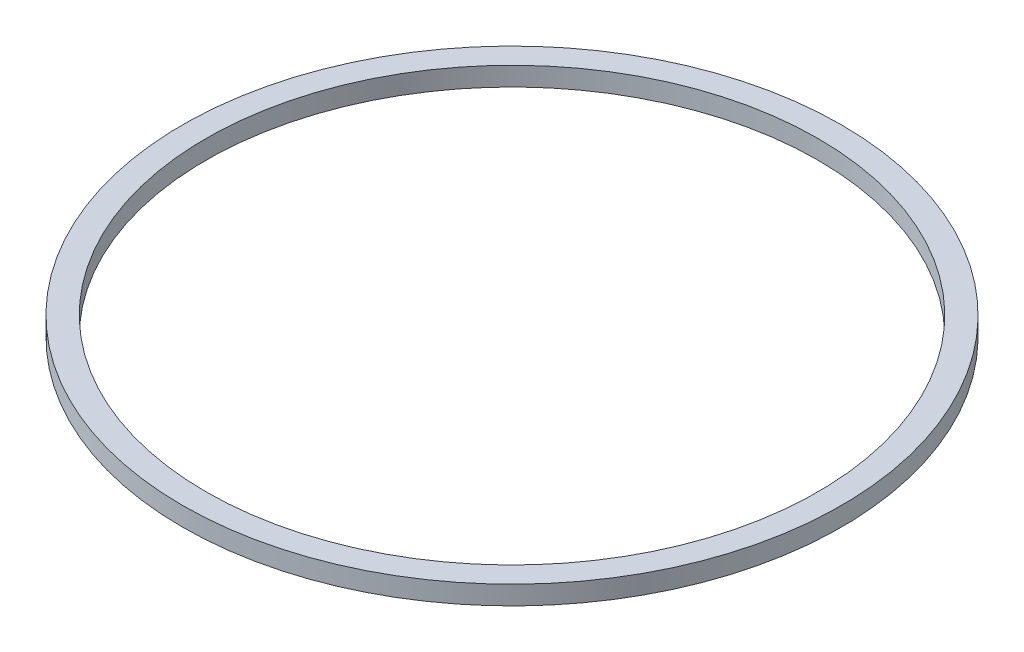
ISO-10303-21;
HEADER;
FILE_DESCRIPTION(('STEP AP214'),'2;1');
FILE_NAME('part.step','',(''),(''),'','','');
FILE_SCHEMA(('AUTOMOTIVE_DESIGN { 1 0 10303 214 1 1 1 1 }'));
ENDSEC;
DATA;
#1=APPLICATION_CONTEXT('core data for automotive mechanical design processes');
#2=APPLICATION_PROTOCOL_DEFINITION('international standard','automotive_design',2000,#1);
#3=PRODUCT_CONTEXT('',#1,'mechanical');
#4=PRODUCT('Part','Part','',(#3));
#5=PRODUCT_RELATED_PRODUCT_CATEGORY('part','',(#4));
#6=PRODUCT_DEFINITION_FORMATION('','',#4);
#7=PRODUCT_DEFINITION_CONTEXT('part definition',#1,'design');
#8=PRODUCT_DEFINITION('design','',#6,#7);
#9=PRODUCT_DEFINITION_SHAPE('','',#8);
#10=(LENGTH_UNIT() NAMED_UNIT(*) SI_UNIT(.MILLI.,.METRE.));
#11=(NAMED_UNIT(*) PLANE_ANGLE_UNIT() SI_UNIT($,.RADIAN.));
#12=(NAMED_UNIT(*) SI_UNIT($,.STERADIAN.) SOLID_ANGLE_UNIT());
#13=UNCERTAINTY_MEASURE_WITH_UNIT(LENGTH_MEASURE(1.E-05),#10,'distance_accuracy_value','');
#14=(GEOMETRIC_REPRESENTATION_CONTEXT(3) GLOBAL_UNCERTAINTY_ASSIGNED_CONTEXT((#13)) GLOBAL_UNIT_ASSIGNED_CONTEXT((#10,
#11,#12)) REPRESENTATION_CONTEXT('',''));
#15=CARTESIAN_POINT('',(0.,0.,0.));
#16=DIRECTION('',(0.,0.,1.));
#17=DIRECTION('',(1.,0.,0.));
#18=AXIS2_PLACEMENT_3D('',#15,#16,#17);
#19=CARTESIAN_POINT('',(0.,10.,0.));
#20=DIRECTION('',(0.,1.,0.));
#21=DIRECTION('',(0.,0.,1.));
#22=AXIS2_PLACEMENT_3D('',#19,#20,#21);
#23=PLANE('',#22);
#24=CARTESIAN_POINT('',(0.,10.,0.));
#25=DIRECTION('',(0.,1.,0.));
#26=DIRECTION('',(0.,0.,1.));
#27=AXIS2_PLACEMENT_3D('',#24,#25,#26);
#28=CIRCLE('',#27,350.);
#29=CARTESIAN_POINT('',(0.,10.,350.));
#30=VERTEX_POINT('',#29);
#31=EDGE_CURVE('E10',#30,#30,#28,.T.);
#32=ORIENTED_EDGE('',*,*,#31,.T.);
#33=EDGE_LOOP('',(#32));
#34=FACE_BOUND('',#33,.T.);
#35=CARTESIAN_POINT('',(0.,10.,0.));
#36=DIRECTION('',(0.,1.,0.));
#37=DIRECTION('',(0.,0.,1.));
#38=AXIS2_PLACEMENT_3D('',#35,#36,#37);
#39=CIRCLE('',#38,325.);
#40=CARTESIAN_POINT('',(0.,10.,325.));
#41=VERTEX_POINT('',#40);
#42=EDGE_CURVE('E42',#41,#41,#39,.T.);
#43=ORIENTED_EDGE('',*,*,#42,.F.);
#44=EDGE_LOOP('',(#43));
#45=FACE_BOUND('',#44,.T.);
#46=ADVANCED_FACE('F31',(#34,#45),#23,.T.);
#47=CARTESIAN_POINT('',(0.,-10.,0.));
#48=DIRECTION('',(0.,1.,0.));
#49=DIRECTION('',(0.,0.,1.));
#50=AXIS2_PLACEMENT_3D('',#47,#48,#49);
#51=PLANE('',#50);
#52=CARTESIAN_POINT('',(0.,-10.,0.));
#53=DIRECTION('',(0.,1.,0.));
#54=DIRECTION('',(0.,0.,1.));
#55=AXIS2_PLACEMENT_3D('',#52,#53,#54);
#56=CIRCLE('',#55,350.);
#57=CARTESIAN_POINT('',(0.,-10.,350.));
#58=VERTEX_POINT('',#57);
#59=EDGE_CURVE('E35',#58,#58,#56,.T.);
#60=ORIENTED_EDGE('',*,*,#59,.F.);
#61=EDGE_LOOP('',(#60));
#62=FACE_BOUND('',#61,.T.);
#63=CARTESIAN_POINT('',(0.,-10.,0.));
#64=DIRECTION('',(0.,1.,0.));
#65=DIRECTION('',(0.,0.,1.));
#66=AXIS2_PLACEMENT_3D('',#63,#64,#65);
#67=CIRCLE('',#66,325.);
#68=CARTESIAN_POINT('',(0.,-10.,325.));
#69=VERTEX_POINT('',#68);
#70=EDGE_CURVE('E44',#69,#69,#67,.T.);
#71=ORIENTED_EDGE('',*,*,#70,.T.);
#72=EDGE_LOOP('',(#71));
#73=FACE_BOUND('',#72,.T.);
#74=ADVANCED_FACE('F54',(#62,#73),#51,.F.);
#75=CARTESIAN_POINT('',(0.,10.,0.));
#76=DIRECTION('',(0.,-1.,0.));
#77=DIRECTION('',(0.,0.,-1.));
#78=AXIS2_PLACEMENT_3D('',#75,#76,#77);
#79=CYLINDRICAL_SURFACE('',#78,350.);
#80=ORIENTED_EDGE('',*,*,#31,.F.);
#81=EDGE_LOOP('',(#80));
#82=FACE_BOUND('',#81,.T.);
#83=ORIENTED_EDGE('',*,*,#59,.T.);
#84=EDGE_LOOP('',(#83));
#85=FACE_BOUND('',#84,.T.);
#86=ADVANCED_FACE('F33',(#82,#85),#79,.T.);
#87=CARTESIAN_POINT('',(0.,10.,0.));
#88=DIRECTION('',(0.,-1.,0.));
#89=DIRECTION('',(0.,0.,-1.));
#90=AXIS2_PLACEMENT_3D('',#87,#88,#89);
#91=CYLINDRICAL_SURFACE('',#90,325.);
#92=ORIENTED_EDGE('',*,*,#42,.T.);
#93=EDGE_LOOP('',(#92));
#94=FACE_BOUND('',#93,.T.);
#95=ORIENTED_EDGE('',*,*,#70,.F.);
#96=EDGE_LOOP('',(#95));
#97=FACE_BOUND('',#96,.T.);
#98=ADVANCED_FACE('F50',(#94,#97),#91,.F.);
#99=CLOSED_SHELL('',(#46,#74,#86,#98));
#100=MANIFOLD_SOLID_BREP('B2',#99);
#101=ADVANCED_BREP_SHAPE_REPRESENTATION('',(#18,#100),#14);
#102=SHAPE_DEFINITION_REPRESENTATION(#9,#101);
ENDSEC;
END-ISO-10303-21;
